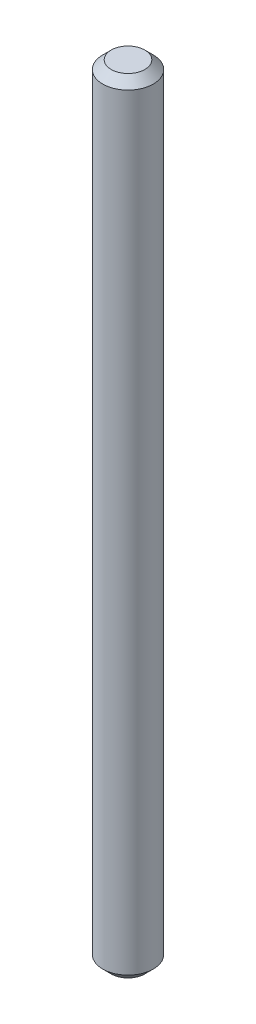
ISO-10303-21;
HEADER;
FILE_DESCRIPTION(('STEP AP214'),'2;1');
FILE_NAME('part.step','',(''),(''),'','','');
FILE_SCHEMA(('AUTOMOTIVE_DESIGN { 1 0 10303 214 1 1 1 1 }'));
ENDSEC;
DATA;
#1=APPLICATION_CONTEXT('core data for automotive mechanical design processes');
#2=APPLICATION_PROTOCOL_DEFINITION('international standard','automotive_design',2000,#1);
#3=PRODUCT_CONTEXT('',#1,'mechanical');
#4=PRODUCT('Part','Part','',(#3));
#5=PRODUCT_RELATED_PRODUCT_CATEGORY('part','',(#4));
#6=PRODUCT_DEFINITION_FORMATION('','',#4);
#7=PRODUCT_DEFINITION_CONTEXT('part definition',#1,'design');
#8=PRODUCT_DEFINITION('design','',#6,#7);
#9=PRODUCT_DEFINITION_SHAPE('','',#8);
#10=(LENGTH_UNIT() NAMED_UNIT(*) SI_UNIT(.MILLI.,.METRE.));
#11=(NAMED_UNIT(*) PLANE_ANGLE_UNIT() SI_UNIT($,.RADIAN.));
#12=(NAMED_UNIT(*) SI_UNIT($,.STERADIAN.) SOLID_ANGLE_UNIT());
#13=UNCERTAINTY_MEASURE_WITH_UNIT(LENGTH_MEASURE(1.E-05),#10,'distance_accuracy_value','');
#14=(GEOMETRIC_REPRESENTATION_CONTEXT(3) GLOBAL_UNCERTAINTY_ASSIGNED_CONTEXT((#13)) GLOBAL_UNIT_ASSIGNED_CONTEXT((#10,
#11,#12)) REPRESENTATION_CONTEXT('',''));
#15=CARTESIAN_POINT('',(0.,0.,0.));
#16=DIRECTION('',(0.,0.,1.));
#17=DIRECTION('',(1.,0.,0.));
#18=AXIS2_PLACEMENT_3D('',#15,#16,#17);
#19=CARTESIAN_POINT('',(0.,93.,0.));
#20=DIRECTION('',(0.,1.,0.));
#21=DIRECTION('',(0.,0.,1.));
#22=AXIS2_PLACEMENT_3D('',#19,#20,#21);
#23=PLANE('',#22);
#24=CARTESIAN_POINT('',(0.,93.,0.));
#25=DIRECTION('',(0.,1.,0.));
#26=DIRECTION('',(0.,0.,1.));
#27=AXIS2_PLACEMENT_3D('',#24,#25,#26);
#28=CIRCLE('',#27,1.99999999999997);
#29=CARTESIAN_POINT('',(0.,93.,1.99999999999997));
#30=VERTEX_POINT('',#29);
#31=EDGE_CURVE('E48',#30,#30,#28,.T.);
#32=ORIENTED_EDGE('',*,*,#31,.T.);
#33=EDGE_LOOP('',(#32));
#34=FACE_BOUND('',#33,.T.);
#35=ADVANCED_FACE('F39',(#34),#23,.T.);
#36=CARTESIAN_POINT('',(0.,0.,0.));
#37=DIRECTION('',(0.,-1.,0.));
#38=DIRECTION('',(0.,0.,-1.));
#39=AXIS2_PLACEMENT_3D('',#36,#37,#38);
#40=CYLINDRICAL_SURFACE('',#39,3.);
#41=CARTESIAN_POINT('',(0.,92.,0.));
#42=DIRECTION('',(0.,1.,0.));
#43=DIRECTION('',(0.,0.,1.));
#44=AXIS2_PLACEMENT_3D('',#41,#42,#43);
#45=CIRCLE('',#44,3.);
#46=CARTESIAN_POINT('',(0.,92.,3.));
#47=VERTEX_POINT('',#46);
#48=EDGE_CURVE('E53',#47,#47,#45,.F.);
#49=ORIENTED_EDGE('',*,*,#48,.T.);
#50=EDGE_LOOP('',(#49));
#51=FACE_BOUND('',#50,.T.);
#52=CARTESIAN_POINT('',(0.,0.999999999999999,0.));
#53=DIRECTION('',(0.,-1.,0.));
#54=DIRECTION('',(0.,0.,-1.));
#55=AXIS2_PLACEMENT_3D('',#52,#53,#54);
#56=CIRCLE('',#55,3.);
#57=CARTESIAN_POINT('',(0.,0.999999999999999,-3.));
#58=VERTEX_POINT('',#57);
#59=EDGE_CURVE('E58',#58,#58,#56,.F.);
#60=ORIENTED_EDGE('',*,*,#59,.T.);
#61=EDGE_LOOP('',(#60));
#62=FACE_BOUND('',#61,.T.);
#63=ADVANCED_FACE('F65',(#51,#62),#40,.T.);
#64=CARTESIAN_POINT('',(0.,0.,0.));
#65=DIRECTION('',(0.,-1.,0.));
#66=DIRECTION('',(0.,0.,-1.));
#67=AXIS2_PLACEMENT_3D('',#64,#65,#66);
#68=PLANE('',#67);
#69=CARTESIAN_POINT('',(0.,0.,0.));
#70=DIRECTION('',(0.,-1.,0.));
#71=DIRECTION('',(0.,0.,-1.));
#72=AXIS2_PLACEMENT_3D('',#69,#70,#71);
#73=CIRCLE('',#72,2.);
#74=CARTESIAN_POINT('',(0.,0.,-2.));
#75=VERTEX_POINT('',#74);
#76=EDGE_CURVE('E10',#75,#75,#73,.T.);
#77=ORIENTED_EDGE('',*,*,#76,.T.);
#78=EDGE_LOOP('',(#77));
#79=FACE_BOUND('',#78,.T.);
#80=ADVANCED_FACE('F73',(#79),#68,.T.);
#81=CARTESIAN_POINT('',(0.,92.,0.));
#82=DIRECTION('',(0.,-1.,0.));
#83=DIRECTION('',(0.,0.,-1.));
#84=AXIS2_PLACEMENT_3D('',#81,#82,#83);
#85=CONICAL_SURFACE('',#84,3.,0.785398163397447);
#86=ORIENTED_EDGE('',*,*,#31,.F.);
#87=EDGE_LOOP('',(#86));
#88=FACE_BOUND('',#87,.T.);
#89=ORIENTED_EDGE('',*,*,#48,.F.);
#90=EDGE_LOOP('',(#89));
#91=FACE_BOUND('',#90,.T.);
#92=ADVANCED_FACE('F69',(#88,#91),#85,.T.);
#93=CARTESIAN_POINT('',(0.,0.,0.));
#94=DIRECTION('',(0.,1.,0.));
#95=DIRECTION('',(0.,0.,1.));
#96=AXIS2_PLACEMENT_3D('',#93,#94,#95);
#97=CONICAL_SURFACE('',#96,2.,0.785398163397448);
#98=ORIENTED_EDGE('',*,*,#59,.F.);
#99=EDGE_LOOP('',(#98));
#100=FACE_BOUND('',#99,.T.);
#101=ORIENTED_EDGE('',*,*,#76,.F.);
#102=EDGE_LOOP('',(#101));
#103=FACE_BOUND('',#102,.T.);
#104=ADVANCED_FACE('F42',(#100,#103),#97,.T.);
#105=CLOSED_SHELL('',(#35,#63,#80,#92,#104));
#106=MANIFOLD_SOLID_BREP('B2',#105);
#107=ADVANCED_BREP_SHAPE_REPRESENTATION('',(#18,#106),#14);
#108=SHAPE_DEFINITION_REPRESENTATION(#9,#107);
ENDSEC;
END-ISO-10303-21;
